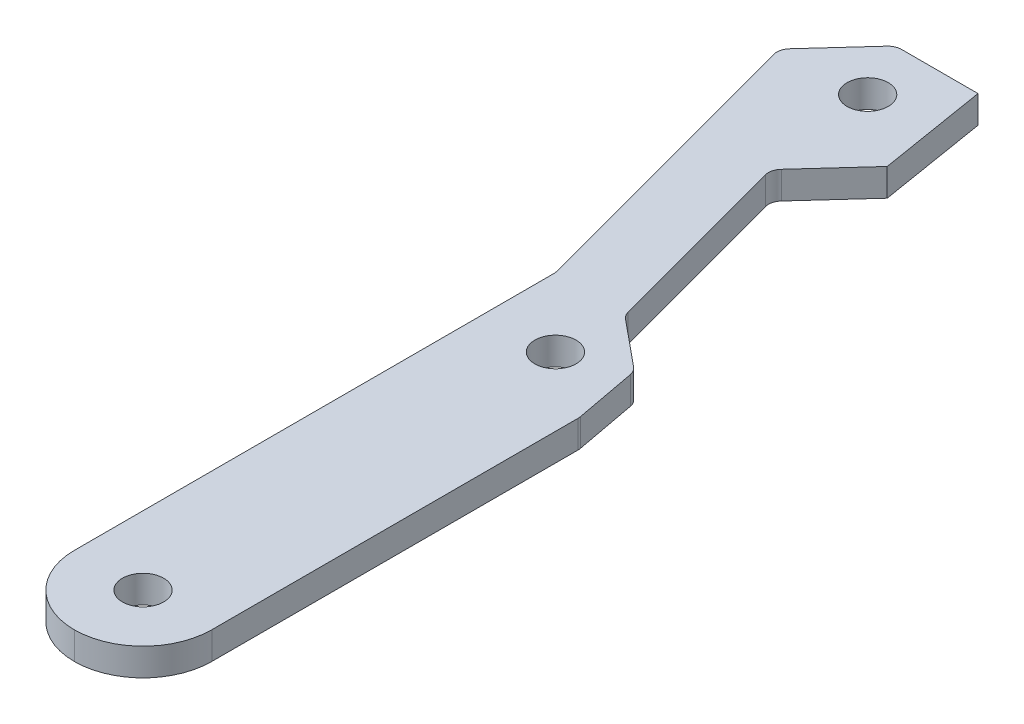
ISO-10303-21;
HEADER;
FILE_DESCRIPTION(('STEP AP214'),'2;1');
FILE_NAME('part.step','',(''),(''),'','','');
FILE_SCHEMA(('AUTOMOTIVE_DESIGN { 1 0 10303 214 1 1 1 1 }'));
ENDSEC;
DATA;
#1=APPLICATION_CONTEXT('core data for automotive mechanical design processes');
#2=APPLICATION_PROTOCOL_DEFINITION('international standard','automotive_design',2000,#1);
#3=PRODUCT_CONTEXT('',#1,'mechanical');
#4=PRODUCT('Part','Part','',(#3));
#5=PRODUCT_RELATED_PRODUCT_CATEGORY('part','',(#4));
#6=PRODUCT_DEFINITION_FORMATION('','',#4);
#7=PRODUCT_DEFINITION_CONTEXT('part definition',#1,'design');
#8=PRODUCT_DEFINITION('design','',#6,#7);
#9=PRODUCT_DEFINITION_SHAPE('','',#8);
#10=(LENGTH_UNIT() NAMED_UNIT(*) SI_UNIT(.MILLI.,.METRE.));
#11=(NAMED_UNIT(*) PLANE_ANGLE_UNIT() SI_UNIT($,.RADIAN.));
#12=(NAMED_UNIT(*) SI_UNIT($,.STERADIAN.) SOLID_ANGLE_UNIT());
#13=UNCERTAINTY_MEASURE_WITH_UNIT(LENGTH_MEASURE(1.E-05),#10,'distance_accuracy_value','');
#14=(GEOMETRIC_REPRESENTATION_CONTEXT(3) GLOBAL_UNCERTAINTY_ASSIGNED_CONTEXT((#13)) GLOBAL_UNIT_ASSIGNED_CONTEXT((#10,
#11,#12)) REPRESENTATION_CONTEXT('',''));
#15=CARTESIAN_POINT('',(0.,0.,0.));
#16=DIRECTION('',(0.,0.,1.));
#17=DIRECTION('',(1.,0.,0.));
#18=AXIS2_PLACEMENT_3D('',#15,#16,#17);
#19=CARTESIAN_POINT('',(9.0831072984746,2.,-36.6564955514148));
#20=DIRECTION('',(-0.635180695093632,0.,0.772363570205361));
#21=DIRECTION('',(0.77236357020536,0.,0.635180695093632));
#22=AXIS2_PLACEMENT_3D('',#19,#20,#21);
#23=PLANE('',#22);
#24=DIRECTION('',(-0.772363570205361,0.,-0.635180695093632));
#25=VECTOR('',#24,1.);
#26=CARTESIAN_POINT('',(9.0831072984746,0.,-36.6564955514148));
#27=LINE('',#26,#25);
#28=CARTESIAN_POINT('',(8.80198994888827,0.,-36.8876824178094));
#29=VERTEX_POINT('',#28);
#30=CARTESIAN_POINT('',(5.46902004973484,0.,-39.6286689414326));
#31=VERTEX_POINT('',#30);
#32=EDGE_CURVE('E211',#29,#31,#27,.T.);
#33=ORIENTED_EDGE('',*,*,#32,.T.);
#34=DIRECTION('',(0.,-1.,0.));
#35=VECTOR('',#34,1.);
#36=CARTESIAN_POINT('',(5.46902004973484,2.,-39.6286689414326));
#37=LINE('',#36,#35);
#38=CARTESIAN_POINT('',(5.46902004973484,2.,-39.6286689414326));
#39=VERTEX_POINT('',#38);
#40=EDGE_CURVE('E296',#31,#39,#37,.F.);
#41=ORIENTED_EDGE('',*,*,#40,.T.);
#42=DIRECTION('',(-0.772363570205361,0.,-0.635180695093632));
#43=VECTOR('',#42,1.);
#44=CARTESIAN_POINT('',(9.0831072984746,2.,-36.6564955514148));
#45=LINE('',#44,#43);
#46=CARTESIAN_POINT('',(8.80198994888827,2.,-36.8876824178094));
#47=VERTEX_POINT('',#46);
#48=EDGE_CURVE('E237',#47,#39,#45,.T.);
#49=ORIENTED_EDGE('',*,*,#48,.F.);
#50=DIRECTION('',(0.,-1.,0.));
#51=VECTOR('',#50,1.);
#52=CARTESIAN_POINT('',(8.80198994888827,2.,-36.8876824178094));
#53=LINE('',#52,#51);
#54=EDGE_CURVE('E293',#47,#29,#53,.T.);
#55=ORIENTED_EDGE('',*,*,#54,.T.);
#56=EDGE_LOOP('',(#33,#41,#49,#55));
#57=FACE_BOUND('',#56,.T.);
#58=ADVANCED_FACE('F36',(#57),#23,.F.);
#59=CARTESIAN_POINT('',(5.22128944744779,2.,-39.832399026883));
#60=DIRECTION('',(-0.965925826289068,0.,0.258819045102522));
#61=DIRECTION('',(0.258819045102522,0.,0.965925826289068));
#62=AXIS2_PLACEMENT_3D('',#59,#60,#61);
#63=PLANE('',#62);
#64=DIRECTION('',(-0.258819045102522,0.,-0.965925826289068));
#65=VECTOR('',#64,1.);
#66=CARTESIAN_POINT('',(5.22128944744779,0.,-39.832399026883));
#67=LINE('',#66,#65);
#68=CARTESIAN_POINT('',(5.1382749185394,0.,-40.1422134665355));
#69=VERTEX_POINT('',#68);
#70=CARTESIAN_POINT('',(1.4805239588902,0.,-53.7931258893801));
#71=VERTEX_POINT('',#70);
#72=EDGE_CURVE('E214',#69,#71,#67,.T.);
#73=ORIENTED_EDGE('',*,*,#72,.T.);
#74=DIRECTION('',(0.,-1.,0.));
#75=VECTOR('',#74,1.);
#76=CARTESIAN_POINT('',(1.4805239588902,2.,-53.7931258893801));
#77=LINE('',#76,#75);
#78=CARTESIAN_POINT('',(1.4805239588902,2.,-53.7931258893801));
#79=VERTEX_POINT('',#78);
#80=EDGE_CURVE('E291',#71,#79,#77,.F.);
#81=ORIENTED_EDGE('',*,*,#80,.T.);
#82=DIRECTION('',(-0.258819045102522,0.,-0.965925826289068));
#83=VECTOR('',#82,1.);
#84=CARTESIAN_POINT('',(5.22128944744779,2.,-39.832399026883));
#85=LINE('',#84,#83);
#86=CARTESIAN_POINT('',(5.1382749185394,2.,-40.1422134665355));
#87=VERTEX_POINT('',#86);
#88=EDGE_CURVE('E180',#87,#79,#85,.T.);
#89=ORIENTED_EDGE('',*,*,#88,.F.);
#90=DIRECTION('',(0.,-1.,0.));
#91=VECTOR('',#90,1.);
#92=CARTESIAN_POINT('',(5.1382749185394,0.,-40.1422134665355));
#93=LINE('',#92,#91);
#94=EDGE_CURVE('E288',#87,#69,#93,.T.);
#95=ORIENTED_EDGE('',*,*,#94,.T.);
#96=EDGE_LOOP('',(#73,#81,#89,#95));
#97=FACE_BOUND('',#96,.T.);
#98=ADVANCED_FACE('F326',(#97),#63,.F.);
#99=CARTESIAN_POINT('',(5.38009652094981,2.,-58.7563252469313));
#100=DIRECTION('',(-0.739173137618714,0.,-0.673515458339974));
#101=DIRECTION('',(-0.673515458339974,0.,0.739173137618714));
#102=AXIS2_PLACEMENT_3D('',#99,#100,#101);
#103=PLANE('',#102);
#104=DIRECTION('',(0.673515458339974,0.,-0.739173137618714));
#105=VECTOR('',#104,1.);
#106=CARTESIAN_POINT('',(5.38009652094981,2.,-58.7563252469313));
#107=LINE('',#106,#105);
#108=CARTESIAN_POINT('',(1.70727664756055,2.,-54.7254603928226));
#109=VERTEX_POINT('',#108);
#110=CARTESIAN_POINT('',(5.38009652094981,2.,-58.7563252469313));
#111=VERTEX_POINT('',#110);
#112=EDGE_CURVE('E167',#109,#111,#107,.T.);
#113=ORIENTED_EDGE('',*,*,#112,.F.);
#114=DIRECTION('',(0.,-1.,0.));
#115=VECTOR('',#114,1.);
#116=CARTESIAN_POINT('',(1.70727664756055,0.,-54.7254603928226));
#117=LINE('',#116,#115);
#118=CARTESIAN_POINT('',(1.70727664756055,0.,-54.7254603928226));
#119=VERTEX_POINT('',#118);
#120=EDGE_CURVE('E286',#109,#119,#117,.T.);
#121=ORIENTED_EDGE('',*,*,#120,.T.);
#122=DIRECTION('',(0.673515458339974,0.,-0.739173137618714));
#123=VECTOR('',#122,1.);
#124=CARTESIAN_POINT('',(5.38009652094981,0.,-58.7563252469313));
#125=LINE('',#124,#123);
#126=CARTESIAN_POINT('',(5.38009652094981,0.,-58.7563252469313));
#127=VERTEX_POINT('',#126);
#128=EDGE_CURVE('E186',#119,#127,#125,.T.);
#129=ORIENTED_EDGE('',*,*,#128,.T.);
#130=DIRECTION('',(0.,-1.,0.));
#131=VECTOR('',#130,1.);
#132=CARTESIAN_POINT('',(5.38009652094981,2.,-58.7563252469313));
#133=LINE('',#132,#131);
#134=EDGE_CURVE('E183',#111,#127,#133,.T.);
#135=ORIENTED_EDGE('',*,*,#134,.F.);
#136=EDGE_LOOP('',(#113,#121,#129,#135));
#137=FACE_BOUND('',#136,.T.);
#138=ADVANCED_FACE('F184',(#137),#103,.F.);
#139=CARTESIAN_POINT('',(4.08825471268183,2.,-66.6513328303609));
#140=DIRECTION('',(-0.9868759479287,0.,0.161480226033497));
#141=DIRECTION('',(0.161480226033497,0.,0.9868759479287));
#142=AXIS2_PLACEMENT_3D('',#139,#140,#141);
#143=PLANE('',#142);
#144=DIRECTION('',(-0.161480226033497,0.,-0.9868759479287));
#145=VECTOR('',#144,1.);
#146=CARTESIAN_POINT('',(4.08825471268183,0.,-66.6513328303609));
#147=LINE('',#146,#145);
#148=CARTESIAN_POINT('',(4.08825471268183,0.,-66.6513328303609));
#149=VERTEX_POINT('',#148);
#150=EDGE_CURVE('E219',#127,#149,#147,.T.);
#151=ORIENTED_EDGE('',*,*,#150,.T.);
#152=DIRECTION('',(0.,-1.,0.));
#153=VECTOR('',#152,1.);
#154=CARTESIAN_POINT('',(4.08825471268183,2.,-66.6513328303609));
#155=LINE('',#154,#153);
#156=CARTESIAN_POINT('',(4.08825471268183,2.,-66.6513328303609));
#157=VERTEX_POINT('',#156);
#158=EDGE_CURVE('E190',#157,#149,#155,.T.);
#159=ORIENTED_EDGE('',*,*,#158,.F.);
#160=DIRECTION('',(-0.161480226033497,0.,-0.9868759479287));
#161=VECTOR('',#160,1.);
#162=CARTESIAN_POINT('',(4.08825471268183,2.,-66.6513328303609));
#163=LINE('',#162,#161);
#164=EDGE_CURVE('E172',#111,#157,#163,.T.);
#165=ORIENTED_EDGE('',*,*,#164,.F.);
#166=ORIENTED_EDGE('',*,*,#134,.T.);
#167=EDGE_LOOP('',(#151,#159,#165,#166));
#168=FACE_BOUND('',#167,.T.);
#169=ADVANCED_FACE('F192',(#168),#143,.F.);
#170=CARTESIAN_POINT('',(-1.91174528731817,2.,-66.6513328303609));
#171=DIRECTION('',(0.,0.,1.));
#172=DIRECTION('',(1.,0.,0.));
#173=AXIS2_PLACEMENT_3D('',#170,#171,#172);
#174=PLANE('',#173);
#175=DIRECTION('',(-1.,0.,0.));
#176=VECTOR('',#175,1.);
#177=CARTESIAN_POINT('',(-1.91174528731817,0.,-66.6513328303609));
#178=LINE('',#177,#176);
#179=CARTESIAN_POINT('',(-1.47005642574534,0.,-66.6513328303609));
#180=VERTEX_POINT('',#179);
#181=EDGE_CURVE('E221',#149,#180,#178,.T.);
#182=ORIENTED_EDGE('',*,*,#181,.T.);
#183=DIRECTION('',(0.,-1.,0.));
#184=VECTOR('',#183,1.);
#185=CARTESIAN_POINT('',(-1.47005642574534,2.,-66.6513328303609));
#186=LINE('',#185,#184);
#187=CARTESIAN_POINT('',(-1.47005642574534,2.,-66.6513328303609));
#188=VERTEX_POINT('',#187);
#189=EDGE_CURVE('E59',#180,#188,#186,.F.);
#190=ORIENTED_EDGE('',*,*,#189,.T.);
#191=DIRECTION('',(-1.,0.,0.));
#192=VECTOR('',#191,1.);
#193=CARTESIAN_POINT('',(-1.91174528731817,2.,-66.6513328303609));
#194=LINE('',#193,#192);
#195=EDGE_CURVE('E194',#157,#188,#194,.T.);
#196=ORIENTED_EDGE('',*,*,#195,.F.);
#197=ORIENTED_EDGE('',*,*,#158,.T.);
#198=EDGE_LOOP('',(#182,#190,#196,#197));
#199=FACE_BOUND('',#198,.T.);
#200=ADVANCED_FACE('F451',(#199),#174,.F.);
#201=CARTESIAN_POINT('',(-5.952838037358,2.,-62.2162940046486));
#202=DIRECTION('',(0.739173137618715,0.,0.673515458339973));
#203=DIRECTION('',(0.673515458339973,0.,-0.739173137618715));
#204=AXIS2_PLACEMENT_3D('',#201,#202,#203);
#205=PLANE('',#204);
#206=DIRECTION('',(-0.673515458339973,0.,0.739173137618715));
#207=VECTOR('',#206,1.);
#208=CARTESIAN_POINT('',(-5.952838037358,0.,-62.2162940046486));
#209=LINE('',#208,#207);
#210=CARTESIAN_POINT('',(-2.20922956336405,0.,-66.3248482887008));
#211=VERTEX_POINT('',#210);
#212=CARTESIAN_POINT('',(-5.58456516070742,0.,-62.6204679762522));
#213=VERTEX_POINT('',#212);
#214=EDGE_CURVE('E223',#211,#213,#209,.T.);
#215=ORIENTED_EDGE('',*,*,#214,.T.);
#216=DIRECTION('',(0.,-1.,0.));
#217=VECTOR('',#216,1.);
#218=CARTESIAN_POINT('',(-5.58456516070742,2.,-62.6204679762522));
#219=LINE('',#218,#217);
#220=CARTESIAN_POINT('',(-5.58456516070742,2.,-62.6204679762522));
#221=VERTEX_POINT('',#220);
#222=EDGE_CURVE('E272',#213,#221,#219,.F.);
#223=ORIENTED_EDGE('',*,*,#222,.T.);
#224=DIRECTION('',(-0.673515458339973,0.,0.739173137618715));
#225=VECTOR('',#224,1.);
#226=CARTESIAN_POINT('',(-5.952838037358,2.,-62.2162940046486));
#227=LINE('',#226,#225);
#228=CARTESIAN_POINT('',(-2.20922956336405,2.,-66.3248482887008));
#229=VERTEX_POINT('',#228);
#230=EDGE_CURVE('E196',#229,#221,#227,.T.);
#231=ORIENTED_EDGE('',*,*,#230,.F.);
#232=DIRECTION('',(0.,-1.,0.));
#233=VECTOR('',#232,1.);
#234=CARTESIAN_POINT('',(-2.20922956336405,2.,-66.3248482887008));
#235=LINE('',#234,#233);
#236=EDGE_CURVE('E269',#229,#211,#235,.T.);
#237=ORIENTED_EDGE('',*,*,#236,.T.);
#238=EDGE_LOOP('',(#215,#223,#231,#237));
#239=FACE_BOUND('',#238,.T.);
#240=ADVANCED_FACE('F446',(#239),#205,.F.);
#241=CARTESIAN_POINT('',(0.,2.,-40.));
#242=DIRECTION('',(0.965925826289068,0.,-0.258819045102522));
#243=DIRECTION('',(-0.258819045102522,0.,-0.965925826289068));
#244=AXIS2_PLACEMENT_3D('',#241,#242,#243);
#245=PLANE('',#244);
#246=DIRECTION('',(0.258819045102522,0.,0.965925826289068));
#247=VECTOR('',#246,1.);
#248=CARTESIAN_POINT('',(0.,2.,-40.));
#249=LINE('',#248,#247);
#250=CARTESIAN_POINT('',(-5.81131784937778,2.,-61.6881334728097));
#251=VERTEX_POINT('',#250);
#252=CARTESIAN_POINT('',(-0.0340741737109394,2.,-40.1271665475151));
#253=VERTEX_POINT('',#252);
#254=EDGE_CURVE('E201',#251,#253,#249,.T.);
#255=ORIENTED_EDGE('',*,*,#254,.F.);
#256=DIRECTION('',(0.,-1.,0.));
#257=VECTOR('',#256,1.);
#258=CARTESIAN_POINT('',(-5.81131784937778,2.,-61.6881334728097));
#259=LINE('',#258,#257);
#260=CARTESIAN_POINT('',(-5.81131784937778,0.,-61.6881334728097));
#261=VERTEX_POINT('',#260);
#262=EDGE_CURVE('E258',#251,#261,#259,.T.);
#263=ORIENTED_EDGE('',*,*,#262,.T.);
#264=DIRECTION('',(0.258819045102522,0.,0.965925826289068));
#265=VECTOR('',#264,1.);
#266=CARTESIAN_POINT('',(0.,0.,-40.));
#267=LINE('',#266,#265);
#268=CARTESIAN_POINT('',(-0.0340741737109394,0.,-40.1271665475151));
#269=VERTEX_POINT('',#268);
#270=EDGE_CURVE('E226',#261,#269,#267,.T.);
#271=ORIENTED_EDGE('',*,*,#270,.T.);
#272=DIRECTION('',(0.,-1.,0.));
#273=VECTOR('',#272,1.);
#274=CARTESIAN_POINT('',(-0.0340741737109398,2.,-40.1271665475151));
#275=LINE('',#274,#273);
#276=EDGE_CURVE('E253',#269,#253,#275,.F.);
#277=ORIENTED_EDGE('',*,*,#276,.T.);
#278=EDGE_LOOP('',(#255,#263,#271,#277));
#279=FACE_BOUND('',#278,.T.);
#280=ADVANCED_FACE('F440',(#279),#245,.F.);
#281=CARTESIAN_POINT('',(0.,2.,0.));
#282=DIRECTION('',(1.,0.,0.));
#283=DIRECTION('',(0.,0.,-1.));
#284=AXIS2_PLACEMENT_3D('',#281,#282,#283);
#285=PLANE('',#284);
#286=DIRECTION('',(0.,0.,1.));
#287=VECTOR('',#286,1.);
#288=CARTESIAN_POINT('',(0.,2.,0.));
#289=LINE('',#288,#287);
#290=CARTESIAN_POINT('',(0.,2.,-39.8683475024126));
#291=VERTEX_POINT('',#290);
#292=CARTESIAN_POINT('',(0.,2.,-5.));
#293=VERTEX_POINT('',#292);
#294=EDGE_CURVE('E203',#291,#293,#289,.T.);
#295=ORIENTED_EDGE('',*,*,#294,.F.);
#296=DIRECTION('',(0.,-1.,0.));
#297=VECTOR('',#296,1.);
#298=CARTESIAN_POINT('',(0.,0.,-39.8683475024126));
#299=LINE('',#298,#297);
#300=CARTESIAN_POINT('',(0.,0.,-39.8683475024126));
#301=VERTEX_POINT('',#300);
#302=EDGE_CURVE('E282',#291,#301,#299,.T.);
#303=ORIENTED_EDGE('',*,*,#302,.T.);
#304=DIRECTION('',(0.,0.,1.));
#305=VECTOR('',#304,1.);
#306=CARTESIAN_POINT('',(0.,0.,0.));
#307=LINE('',#306,#305);
#308=CARTESIAN_POINT('',(0.,0.,-5.));
#309=VERTEX_POINT('',#308);
#310=EDGE_CURVE('E229',#301,#309,#307,.T.);
#311=ORIENTED_EDGE('',*,*,#310,.T.);
#312=DIRECTION('',(0.,-1.,0.));
#313=VECTOR('',#312,1.);
#314=CARTESIAN_POINT('',(0.,2.,-5.));
#315=LINE('',#314,#313);
#316=EDGE_CURVE('E250',#309,#293,#315,.F.);
#317=ORIENTED_EDGE('',*,*,#316,.T.);
#318=EDGE_LOOP('',(#295,#303,#311,#317));
#319=FACE_BOUND('',#318,.T.);
#320=ADVANCED_FACE('F435',(#319),#285,.F.);
#321=CARTESIAN_POINT('',(10.,2.,-31.7412836766438));
#322=DIRECTION('',(-1.,0.,0.));
#323=DIRECTION('',(0.,0.,1.));
#324=AXIS2_PLACEMENT_3D('',#321,#322,#323);
#325=PLANE('',#324);
#326=DIRECTION('',(0.,0.,-1.));
#327=VECTOR('',#326,1.);
#328=CARTESIAN_POINT('',(10.,0.,-31.7412836766438));
#329=LINE('',#328,#327);
#330=CARTESIAN_POINT('',(10.,0.,-5.));
#331=VERTEX_POINT('',#330);
#332=CARTESIAN_POINT('',(10.,0.,-31.6488103424271));
#333=VERTEX_POINT('',#332);
#334=EDGE_CURVE('E231',#331,#333,#329,.T.);
#335=ORIENTED_EDGE('',*,*,#334,.T.);
#336=DIRECTION('',(0.,-1.,0.));
#337=VECTOR('',#336,1.);
#338=CARTESIAN_POINT('',(10.,2.,-31.6488103424271));
#339=LINE('',#338,#337);
#340=CARTESIAN_POINT('',(10.,2.,-31.6488103424271));
#341=VERTEX_POINT('',#340);
#342=EDGE_CURVE('E303',#333,#341,#339,.F.);
#343=ORIENTED_EDGE('',*,*,#342,.T.);
#344=DIRECTION('',(0.,0.,-1.));
#345=VECTOR('',#344,1.);
#346=CARTESIAN_POINT('',(10.,2.,-31.7412836766438));
#347=LINE('',#346,#345);
#348=CARTESIAN_POINT('',(10.,2.,-5.));
#349=VERTEX_POINT('',#348);
#350=EDGE_CURVE('E205',#349,#341,#347,.T.);
#351=ORIENTED_EDGE('',*,*,#350,.F.);
#352=DIRECTION('',(0.,-1.,0.));
#353=VECTOR('',#352,1.);
#354=CARTESIAN_POINT('',(10.,2.,-5.));
#355=LINE('',#354,#353);
#356=EDGE_CURVE('E189',#349,#331,#355,.T.);
#357=ORIENTED_EDGE('',*,*,#356,.T.);
#358=EDGE_LOOP('',(#335,#343,#351,#357));
#359=FACE_BOUND('',#358,.T.);
#360=ADVANCED_FACE('F425',(#359),#325,.F.);
#361=CARTESIAN_POINT('',(10.,2.,-31.7412836766438));
#362=DIRECTION('',(-0.983042374954192,0.,0.18337854030508));
#363=DIRECTION('',(0.18337854030508,0.,0.983042374954192));
#364=AXIS2_PLACEMENT_3D('',#361,#362,#363);
#365=PLANE('',#364);
#366=DIRECTION('',(-0.18337854030508,0.,-0.983042374954192));
#367=VECTOR('',#366,1.);
#368=CARTESIAN_POINT('',(10.,0.,-31.7412836766438));
#369=LINE('',#368,#367);
#370=CARTESIAN_POINT('',(9.98304237495419,0.,-31.8321888827322));
#371=VERTEX_POINT('',#370);
#372=CARTESIAN_POINT('',(9.14985162874883,0.,-36.2986973879091));
#373=VERTEX_POINT('',#372);
#374=EDGE_CURVE('E234',#371,#373,#369,.T.);
#375=ORIENTED_EDGE('',*,*,#374,.T.);
#376=DIRECTION('',(0.,-1.,0.));
#377=VECTOR('',#376,1.);
#378=CARTESIAN_POINT('',(9.14985162874883,2.,-36.2986973879091));
#379=LINE('',#378,#377);
#380=CARTESIAN_POINT('',(9.14985162874883,2.,-36.2986973879091));
#381=VERTEX_POINT('',#380);
#382=EDGE_CURVE('E301',#373,#381,#379,.F.);
#383=ORIENTED_EDGE('',*,*,#382,.T.);
#384=DIRECTION('',(-0.18337854030508,0.,-0.983042374954192));
#385=VECTOR('',#384,1.);
#386=CARTESIAN_POINT('',(10.,2.,-31.7412836766438));
#387=LINE('',#386,#385);
#388=CARTESIAN_POINT('',(9.98304237495419,2.,-31.8321888827322));
#389=VERTEX_POINT('',#388);
#390=EDGE_CURVE('E208',#389,#381,#387,.T.);
#391=ORIENTED_EDGE('',*,*,#390,.F.);
#392=DIRECTION('',(0.,-1.,0.));
#393=VECTOR('',#392,1.);
#394=CARTESIAN_POINT('',(9.98304237495419,2.,-31.8321888827322));
#395=LINE('',#394,#393);
#396=EDGE_CURVE('E298',#389,#371,#395,.T.);
#397=ORIENTED_EDGE('',*,*,#396,.T.);
#398=EDGE_LOOP('',(#375,#383,#391,#397));
#399=FACE_BOUND('',#398,.T.);
#400=ADVANCED_FACE('F360',(#399),#365,.F.);
#401=CARTESIAN_POINT('',(0.,2.,0.));
#402=DIRECTION('',(0.,1.,0.));
#403=DIRECTION('',(0.,0.,1.));
#404=AXIS2_PLACEMENT_3D('',#401,#402,#403);
#405=PLANE('',#404);
#406=CARTESIAN_POINT('',(0.137851025325924,2.,-62.5746170843418));
#407=DIRECTION('',(0.,1.,0.));
#408=DIRECTION('',(0.,0.,1.));
#409=AXIS2_PLACEMENT_3D('',#406,#407,#408);
#410=CIRCLE('',#409,1.5);
#411=CARTESIAN_POINT('',(0.137851025325924,2.,-61.0746170843418));
#412=VERTEX_POINT('',#411);
#413=EDGE_CURVE('E342',#412,#412,#410,.T.);
#414=ORIENTED_EDGE('',*,*,#413,.F.);
#415=EDGE_LOOP('',(#414));
#416=FACE_BOUND('',#415,.T.);
#417=CARTESIAN_POINT('',(5.,2.,-5.));
#418=DIRECTION('',(0.,1.,0.));
#419=DIRECTION('',(0.,0.,1.));
#420=AXIS2_PLACEMENT_3D('',#417,#418,#419);
#421=CIRCLE('',#420,1.5);
#422=CARTESIAN_POINT('',(5.,2.,-3.5));
#423=VERTEX_POINT('',#422);
#424=EDGE_CURVE('E336',#423,#423,#421,.T.);
#425=ORIENTED_EDGE('',*,*,#424,.F.);
#426=EDGE_LOOP('',(#425));
#427=FACE_BOUND('',#426,.T.);
#428=CARTESIAN_POINT('',(5.,2.,-35.));
#429=DIRECTION('',(0.,1.,0.));
#430=DIRECTION('',(0.,0.,1.));
#431=AXIS2_PLACEMENT_3D('',#428,#429,#430);
#432=CIRCLE('',#431,1.5);
#433=CARTESIAN_POINT('',(5.,2.,-33.5));
#434=VERTEX_POINT('',#433);
#435=EDGE_CURVE('E330',#434,#434,#432,.T.);
#436=ORIENTED_EDGE('',*,*,#435,.F.);
#437=EDGE_LOOP('',(#436));
#438=FACE_BOUND('',#437,.T.);
#439=ORIENTED_EDGE('',*,*,#230,.T.);
#440=CARTESIAN_POINT('',(-4.84539202308871,2.,-61.9469525179122));
#441=DIRECTION('',(0.,1.,0.));
#442=DIRECTION('',(0.,0.,1.));
#443=AXIS2_PLACEMENT_3D('',#440,#441,#442);
#444=CIRCLE('',#443,1.);
#445=EDGE_CURVE('E280',#221,#251,#444,.T.);
#446=ORIENTED_EDGE('',*,*,#445,.T.);
#447=ORIENTED_EDGE('',*,*,#254,.T.);
#448=CARTESIAN_POINT('',(-1.00000000000001,2.,-39.8683475024126));
#449=DIRECTION('',(0.,1.,0.));
#450=DIRECTION('',(0.,0.,1.));
#451=AXIS2_PLACEMENT_3D('',#448,#449,#450);
#452=CIRCLE('',#451,1.);
#453=EDGE_CURVE('E51',#253,#291,#452,.F.);
#454=ORIENTED_EDGE('',*,*,#453,.T.);
#455=ORIENTED_EDGE('',*,*,#294,.T.);
#456=CARTESIAN_POINT('',(5.,2.,-5.));
#457=DIRECTION('',(0.,1.,0.));
#458=DIRECTION('',(0.,0.,1.));
#459=AXIS2_PLACEMENT_3D('',#456,#457,#458);
#460=CIRCLE('',#459,5.);
#461=CARTESIAN_POINT('',(5.,2.,0.));
#462=VERTEX_POINT('',#461);
#463=EDGE_CURVE('E246',#293,#462,#460,.T.);
#464=ORIENTED_EDGE('',*,*,#463,.T.);
#465=CARTESIAN_POINT('',(5.,2.,-5.));
#466=DIRECTION('',(0.,1.,0.));
#467=DIRECTION('',(0.,0.,1.));
#468=AXIS2_PLACEMENT_3D('',#465,#466,#467);
#469=CIRCLE('',#468,5.);
#470=EDGE_CURVE('E248',#462,#349,#469,.T.);
#471=ORIENTED_EDGE('',*,*,#470,.T.);
#472=ORIENTED_EDGE('',*,*,#350,.T.);
#473=CARTESIAN_POINT('',(9.,2.,-31.6488103424271));
#474=DIRECTION('',(0.,1.,0.));
#475=DIRECTION('',(0.,0.,1.));
#476=AXIS2_PLACEMENT_3D('',#473,#474,#475);
#477=CIRCLE('',#476,1.);
#478=EDGE_CURVE('E274',#341,#389,#477,.T.);
#479=ORIENTED_EDGE('',*,*,#478,.T.);
#480=ORIENTED_EDGE('',*,*,#390,.T.);
#481=CARTESIAN_POINT('',(8.16680925379464,2.,-36.115318847604));
#482=DIRECTION('',(0.,1.,0.));
#483=DIRECTION('',(0.,0.,1.));
#484=AXIS2_PLACEMENT_3D('',#481,#482,#483);
#485=CIRCLE('',#484,1.);
#486=EDGE_CURVE('E276',#381,#47,#485,.T.);
#487=ORIENTED_EDGE('',*,*,#486,.T.);
#488=ORIENTED_EDGE('',*,*,#48,.T.);
#489=CARTESIAN_POINT('',(6.10420074482847,2.,-40.401032511638));
#490=DIRECTION('',(0.,1.,0.));
#491=DIRECTION('',(0.,0.,1.));
#492=AXIS2_PLACEMENT_3D('',#489,#490,#491);
#493=CIRCLE('',#492,1.);
#494=EDGE_CURVE('E11',#39,#87,#493,.F.);
#495=ORIENTED_EDGE('',*,*,#494,.T.);
#496=ORIENTED_EDGE('',*,*,#88,.T.);
#497=CARTESIAN_POINT('',(2.44644978517927,2.,-54.0519449344826));
#498=DIRECTION('',(0.,1.,0.));
#499=DIRECTION('',(0.,0.,1.));
#500=AXIS2_PLACEMENT_3D('',#497,#498,#499);
#501=CIRCLE('',#500,1.);
#502=EDGE_CURVE('E176',#79,#109,#501,.F.);
#503=ORIENTED_EDGE('',*,*,#502,.T.);
#504=ORIENTED_EDGE('',*,*,#112,.T.);
#505=ORIENTED_EDGE('',*,*,#164,.T.);
#506=ORIENTED_EDGE('',*,*,#195,.T.);
#507=CARTESIAN_POINT('',(-1.47005642574534,2.,-65.6513328303609));
#508=DIRECTION('',(0.,1.,0.));
#509=DIRECTION('',(0.,0.,1.));
#510=AXIS2_PLACEMENT_3D('',#507,#508,#509);
#511=CIRCLE('',#510,1.);
#512=EDGE_CURVE('E278',#188,#229,#511,.T.);
#513=ORIENTED_EDGE('',*,*,#512,.T.);
#514=EDGE_LOOP('',(#439,#446,#447,#454,#455,#464,#471,#472,#479,#480,#487,#488,#495,#496,#503,
#504,#505,#506,#513));
#515=FACE_BOUND('',#514,.T.);
#516=ADVANCED_FACE('F170',(#416,#427,#438,#515),#405,.T.);
#517=CARTESIAN_POINT('',(0.,0.,0.));
#518=DIRECTION('',(0.,1.,0.));
#519=DIRECTION('',(0.,0.,1.));
#520=AXIS2_PLACEMENT_3D('',#517,#518,#519);
#521=PLANE('',#520);
#522=CARTESIAN_POINT('',(0.137851025325924,0.,-62.5746170843418));
#523=DIRECTION('',(0.,1.,0.));
#524=DIRECTION('',(0.,0.,1.));
#525=AXIS2_PLACEMENT_3D('',#522,#523,#524);
#526=CIRCLE('',#525,1.5);
#527=CARTESIAN_POINT('',(0.137851025325924,0.,-61.0746170843418));
#528=VERTEX_POINT('',#527);
#529=EDGE_CURVE('E256',#528,#528,#526,.T.);
#530=ORIENTED_EDGE('',*,*,#529,.T.);
#531=EDGE_LOOP('',(#530));
#532=FACE_BOUND('',#531,.T.);
#533=CARTESIAN_POINT('',(5.,0.,-5.));
#534=DIRECTION('',(0.,1.,0.));
#535=DIRECTION('',(0.,0.,1.));
#536=AXIS2_PLACEMENT_3D('',#533,#534,#535);
#537=CIRCLE('',#536,1.5);
#538=CARTESIAN_POINT('',(5.,0.,-3.5));
#539=VERTEX_POINT('',#538);
#540=EDGE_CURVE('E339',#539,#539,#537,.T.);
#541=ORIENTED_EDGE('',*,*,#540,.T.);
#542=EDGE_LOOP('',(#541));
#543=FACE_BOUND('',#542,.T.);
#544=CARTESIAN_POINT('',(5.,0.,-35.));
#545=DIRECTION('',(0.,1.,0.));
#546=DIRECTION('',(0.,0.,1.));
#547=AXIS2_PLACEMENT_3D('',#544,#545,#546);
#548=CIRCLE('',#547,1.5);
#549=CARTESIAN_POINT('',(5.,0.,-33.5));
#550=VERTEX_POINT('',#549);
#551=EDGE_CURVE('E333',#550,#550,#548,.T.);
#552=ORIENTED_EDGE('',*,*,#551,.T.);
#553=EDGE_LOOP('',(#552));
#554=FACE_BOUND('',#553,.T.);
#555=ORIENTED_EDGE('',*,*,#270,.F.);
#556=CARTESIAN_POINT('',(-4.84539202308871,0.,-61.9469525179122));
#557=DIRECTION('',(0.,1.,0.));
#558=DIRECTION('',(0.,0.,1.));
#559=AXIS2_PLACEMENT_3D('',#556,#557,#558);
#560=CIRCLE('',#559,1.);
#561=EDGE_CURVE('E267',#261,#213,#560,.F.);
#562=ORIENTED_EDGE('',*,*,#561,.T.);
#563=ORIENTED_EDGE('',*,*,#214,.F.);
#564=CARTESIAN_POINT('',(-1.47005642574534,0.,-65.6513328303609));
#565=DIRECTION('',(0.,1.,0.));
#566=DIRECTION('',(0.,0.,1.));
#567=AXIS2_PLACEMENT_3D('',#564,#565,#566);
#568=CIRCLE('',#567,1.);
#569=EDGE_CURVE('E265',#211,#180,#568,.F.);
#570=ORIENTED_EDGE('',*,*,#569,.T.);
#571=ORIENTED_EDGE('',*,*,#181,.F.);
#572=ORIENTED_EDGE('',*,*,#150,.F.);
#573=ORIENTED_EDGE('',*,*,#128,.F.);
#574=CARTESIAN_POINT('',(2.44644978517927,0.,-54.0519449344826));
#575=DIRECTION('',(0.,1.,0.));
#576=DIRECTION('',(0.,0.,1.));
#577=AXIS2_PLACEMENT_3D('',#574,#575,#576);
#578=CIRCLE('',#577,1.);
#579=EDGE_CURVE('E308',#119,#71,#578,.T.);
#580=ORIENTED_EDGE('',*,*,#579,.T.);
#581=ORIENTED_EDGE('',*,*,#72,.F.);
#582=CARTESIAN_POINT('',(6.10420074482847,0.,-40.401032511638));
#583=DIRECTION('',(0.,1.,0.));
#584=DIRECTION('',(0.,0.,1.));
#585=AXIS2_PLACEMENT_3D('',#582,#583,#584);
#586=CIRCLE('',#585,1.);
#587=EDGE_CURVE('E44',#69,#31,#586,.T.);
#588=ORIENTED_EDGE('',*,*,#587,.T.);
#589=ORIENTED_EDGE('',*,*,#32,.F.);
#590=CARTESIAN_POINT('',(8.16680925379464,0.,-36.115318847604));
#591=DIRECTION('',(0.,1.,0.));
#592=DIRECTION('',(0.,0.,1.));
#593=AXIS2_PLACEMENT_3D('',#590,#591,#592);
#594=CIRCLE('',#593,1.);
#595=EDGE_CURVE('E263',#29,#373,#594,.F.);
#596=ORIENTED_EDGE('',*,*,#595,.T.);
#597=ORIENTED_EDGE('',*,*,#374,.F.);
#598=CARTESIAN_POINT('',(9.,0.,-31.6488103424271));
#599=DIRECTION('',(0.,1.,0.));
#600=DIRECTION('',(0.,0.,1.));
#601=AXIS2_PLACEMENT_3D('',#598,#599,#600);
#602=CIRCLE('',#601,1.);
#603=EDGE_CURVE('E261',#371,#333,#602,.F.);
#604=ORIENTED_EDGE('',*,*,#603,.T.);
#605=ORIENTED_EDGE('',*,*,#334,.F.);
#606=CARTESIAN_POINT('',(5.,0.,-5.));
#607=DIRECTION('',(0.,1.,0.));
#608=DIRECTION('',(0.,0.,1.));
#609=AXIS2_PLACEMENT_3D('',#606,#607,#608);
#610=CIRCLE('',#609,5.);
#611=CARTESIAN_POINT('',(5.,0.,0.));
#612=VERTEX_POINT('',#611);
#613=EDGE_CURVE('E244',#331,#612,#610,.F.);
#614=ORIENTED_EDGE('',*,*,#613,.T.);
#615=CARTESIAN_POINT('',(5.,0.,-5.));
#616=DIRECTION('',(0.,1.,0.));
#617=DIRECTION('',(0.,0.,1.));
#618=AXIS2_PLACEMENT_3D('',#615,#616,#617);
#619=CIRCLE('',#618,5.);
#620=EDGE_CURVE('E241',#612,#309,#619,.F.);
#621=ORIENTED_EDGE('',*,*,#620,.T.);
#622=ORIENTED_EDGE('',*,*,#310,.F.);
#623=CARTESIAN_POINT('',(-1.00000000000001,0.,-39.8683475024126));
#624=DIRECTION('',(0.,1.,0.));
#625=DIRECTION('',(0.,0.,1.));
#626=AXIS2_PLACEMENT_3D('',#623,#624,#625);
#627=CIRCLE('',#626,1.);
#628=EDGE_CURVE('E305',#301,#269,#627,.T.);
#629=ORIENTED_EDGE('',*,*,#628,.T.);
#630=EDGE_LOOP('',(#555,#562,#563,#570,#571,#572,#573,#580,#581,#588,#589,#596,#597,#604,#605,
#614,#621,#622,#629));
#631=FACE_BOUND('',#630,.T.);
#632=ADVANCED_FACE('F314',(#532,#543,#554,#631),#521,.F.);
#633=CARTESIAN_POINT('',(5.,2.,-5.));
#634=DIRECTION('',(0.,-1.,0.));
#635=DIRECTION('',(0.,0.,-1.));
#636=AXIS2_PLACEMENT_3D('',#633,#634,#635);
#637=CYLINDRICAL_SURFACE('',#636,5.);
#638=DIRECTION('',(0.,-1.,0.));
#639=VECTOR('',#638,1.);
#640=CARTESIAN_POINT('',(5.,2.,0.));
#641=LINE('',#640,#639);
#642=EDGE_CURVE('E215',#462,#612,#641,.T.);
#643=ORIENTED_EDGE('',*,*,#642,.F.);
#644=ORIENTED_EDGE('',*,*,#463,.F.);
#645=ORIENTED_EDGE('',*,*,#316,.F.);
#646=ORIENTED_EDGE('',*,*,#620,.F.);
#647=EDGE_LOOP('',(#643,#644,#645,#646));
#648=FACE_BOUND('',#647,.T.);
#649=ADVANCED_FACE('F377',(#648),#637,.T.);
#650=CARTESIAN_POINT('',(5.,2.,-5.));
#651=DIRECTION('',(0.,-1.,0.));
#652=DIRECTION('',(0.,0.,-1.));
#653=AXIS2_PLACEMENT_3D('',#650,#651,#652);
#654=CYLINDRICAL_SURFACE('',#653,5.);
#655=ORIENTED_EDGE('',*,*,#470,.F.);
#656=ORIENTED_EDGE('',*,*,#642,.T.);
#657=ORIENTED_EDGE('',*,*,#613,.F.);
#658=ORIENTED_EDGE('',*,*,#356,.F.);
#659=EDGE_LOOP('',(#655,#656,#657,#658));
#660=FACE_BOUND('',#659,.T.);
#661=ADVANCED_FACE('F368',(#660),#654,.T.);
#662=CARTESIAN_POINT('',(5.,0.,-35.));
#663=DIRECTION('',(0.,1.,0.));
#664=DIRECTION('',(0.,0.,1.));
#665=AXIS2_PLACEMENT_3D('',#662,#663,#664);
#666=CYLINDRICAL_SURFACE('',#665,1.5);
#667=ORIENTED_EDGE('',*,*,#551,.F.);
#668=EDGE_LOOP('',(#667));
#669=FACE_BOUND('',#668,.T.);
#670=ORIENTED_EDGE('',*,*,#435,.T.);
#671=EDGE_LOOP('',(#670));
#672=FACE_BOUND('',#671,.T.);
#673=ADVANCED_FACE('F366',(#669,#672),#666,.F.);
#674=CARTESIAN_POINT('',(5.,0.,-5.));
#675=DIRECTION('',(0.,1.,0.));
#676=DIRECTION('',(0.,0.,1.));
#677=AXIS2_PLACEMENT_3D('',#674,#675,#676);
#678=CYLINDRICAL_SURFACE('',#677,1.5);
#679=ORIENTED_EDGE('',*,*,#540,.F.);
#680=EDGE_LOOP('',(#679));
#681=FACE_BOUND('',#680,.T.);
#682=ORIENTED_EDGE('',*,*,#424,.T.);
#683=EDGE_LOOP('',(#682));
#684=FACE_BOUND('',#683,.T.);
#685=ADVANCED_FACE('F354',(#681,#684),#678,.F.);
#686=CARTESIAN_POINT('',(0.137851025325924,0.,-62.5746170843418));
#687=DIRECTION('',(0.,1.,0.));
#688=DIRECTION('',(0.,0.,1.));
#689=AXIS2_PLACEMENT_3D('',#686,#687,#688);
#690=CYLINDRICAL_SURFACE('',#689,1.5);
#691=ORIENTED_EDGE('',*,*,#529,.F.);
#692=EDGE_LOOP('',(#691));
#693=FACE_BOUND('',#692,.T.);
#694=ORIENTED_EDGE('',*,*,#413,.T.);
#695=EDGE_LOOP('',(#694));
#696=FACE_BOUND('',#695,.T.);
#697=ADVANCED_FACE('F350',(#693,#696),#690,.F.);
#698=CARTESIAN_POINT('',(-4.84539202308871,2.,-61.9469525179122));
#699=DIRECTION('',(0.,-1.,0.));
#700=DIRECTION('',(0.,0.,-1.));
#701=AXIS2_PLACEMENT_3D('',#698,#699,#700);
#702=CYLINDRICAL_SURFACE('',#701,1.);
#703=ORIENTED_EDGE('',*,*,#445,.F.);
#704=ORIENTED_EDGE('',*,*,#222,.F.);
#705=ORIENTED_EDGE('',*,*,#561,.F.);
#706=ORIENTED_EDGE('',*,*,#262,.F.);
#707=EDGE_LOOP('',(#703,#704,#705,#706));
#708=FACE_BOUND('',#707,.T.);
#709=ADVANCED_FACE('F353',(#708),#702,.T.);
#710=CARTESIAN_POINT('',(-1.00000000000001,2.,-39.8683475024126));
#711=DIRECTION('',(0.,1.,0.));
#712=DIRECTION('',(0.,0.,1.));
#713=AXIS2_PLACEMENT_3D('',#710,#711,#712);
#714=CYLINDRICAL_SURFACE('',#713,1.);
#715=ORIENTED_EDGE('',*,*,#453,.F.);
#716=ORIENTED_EDGE('',*,*,#276,.F.);
#717=ORIENTED_EDGE('',*,*,#628,.F.);
#718=ORIENTED_EDGE('',*,*,#302,.F.);
#719=EDGE_LOOP('',(#715,#716,#717,#718));
#720=FACE_BOUND('',#719,.T.);
#721=ADVANCED_FACE('F394',(#720),#714,.F.);
#722=CARTESIAN_POINT('',(-1.47005642574534,2.,-65.6513328303609));
#723=DIRECTION('',(0.,-1.,0.));
#724=DIRECTION('',(0.,0.,-1.));
#725=AXIS2_PLACEMENT_3D('',#722,#723,#724);
#726=CYLINDRICAL_SURFACE('',#725,1.);
#727=ORIENTED_EDGE('',*,*,#512,.F.);
#728=ORIENTED_EDGE('',*,*,#189,.F.);
#729=ORIENTED_EDGE('',*,*,#569,.F.);
#730=ORIENTED_EDGE('',*,*,#236,.F.);
#731=EDGE_LOOP('',(#727,#728,#729,#730));
#732=FACE_BOUND('',#731,.T.);
#733=ADVANCED_FACE('F398',(#732),#726,.T.);
#734=CARTESIAN_POINT('',(2.44644978517927,2.,-54.0519449344826));
#735=DIRECTION('',(0.,1.,0.));
#736=DIRECTION('',(0.,0.,1.));
#737=AXIS2_PLACEMENT_3D('',#734,#735,#736);
#738=CYLINDRICAL_SURFACE('',#737,1.);
#739=ORIENTED_EDGE('',*,*,#502,.F.);
#740=ORIENTED_EDGE('',*,*,#80,.F.);
#741=ORIENTED_EDGE('',*,*,#579,.F.);
#742=ORIENTED_EDGE('',*,*,#120,.F.);
#743=EDGE_LOOP('',(#739,#740,#741,#742));
#744=FACE_BOUND('',#743,.T.);
#745=ADVANCED_FACE('F402',(#744),#738,.F.);
#746=CARTESIAN_POINT('',(6.10420074482847,2.,-40.401032511638));
#747=DIRECTION('',(0.,1.,0.));
#748=DIRECTION('',(0.,0.,1.));
#749=AXIS2_PLACEMENT_3D('',#746,#747,#748);
#750=CYLINDRICAL_SURFACE('',#749,1.);
#751=ORIENTED_EDGE('',*,*,#494,.F.);
#752=ORIENTED_EDGE('',*,*,#40,.F.);
#753=ORIENTED_EDGE('',*,*,#587,.F.);
#754=ORIENTED_EDGE('',*,*,#94,.F.);
#755=EDGE_LOOP('',(#751,#752,#753,#754));
#756=FACE_BOUND('',#755,.T.);
#757=ADVANCED_FACE('F323',(#756),#750,.F.);
#758=CARTESIAN_POINT('',(8.16680925379464,2.,-36.115318847604));
#759=DIRECTION('',(0.,-1.,0.));
#760=DIRECTION('',(0.,0.,-1.));
#761=AXIS2_PLACEMENT_3D('',#758,#759,#760);
#762=CYLINDRICAL_SURFACE('',#761,1.);
#763=ORIENTED_EDGE('',*,*,#486,.F.);
#764=ORIENTED_EDGE('',*,*,#382,.F.);
#765=ORIENTED_EDGE('',*,*,#595,.F.);
#766=ORIENTED_EDGE('',*,*,#54,.F.);
#767=EDGE_LOOP('',(#763,#764,#765,#766));
#768=FACE_BOUND('',#767,.T.);
#769=ADVANCED_FACE('F408',(#768),#762,.T.);
#770=CARTESIAN_POINT('',(9.,2.,-31.6488103424271));
#771=DIRECTION('',(0.,-1.,0.));
#772=DIRECTION('',(0.,0.,-1.));
#773=AXIS2_PLACEMENT_3D('',#770,#771,#772);
#774=CYLINDRICAL_SURFACE('',#773,1.);
#775=ORIENTED_EDGE('',*,*,#478,.F.);
#776=ORIENTED_EDGE('',*,*,#342,.F.);
#777=ORIENTED_EDGE('',*,*,#603,.F.);
#778=ORIENTED_EDGE('',*,*,#396,.F.);
#779=EDGE_LOOP('',(#775,#776,#777,#778));
#780=FACE_BOUND('',#779,.T.);
#781=ADVANCED_FACE('F38',(#780),#774,.T.);
#782=CLOSED_SHELL('',(#58,#98,#138,#169,#200,#240,#280,#320,#360,#400,#516,#632,#649,#661,#673,
#685,#697,#709,#721,#733,#745,#757,#769,#781));
#783=MANIFOLD_SOLID_BREP('B2',#782);
#784=ADVANCED_BREP_SHAPE_REPRESENTATION('',(#18,#783),#14);
#785=SHAPE_DEFINITION_REPRESENTATION(#9,#784);
ENDSEC;
END-ISO-10303-21;
